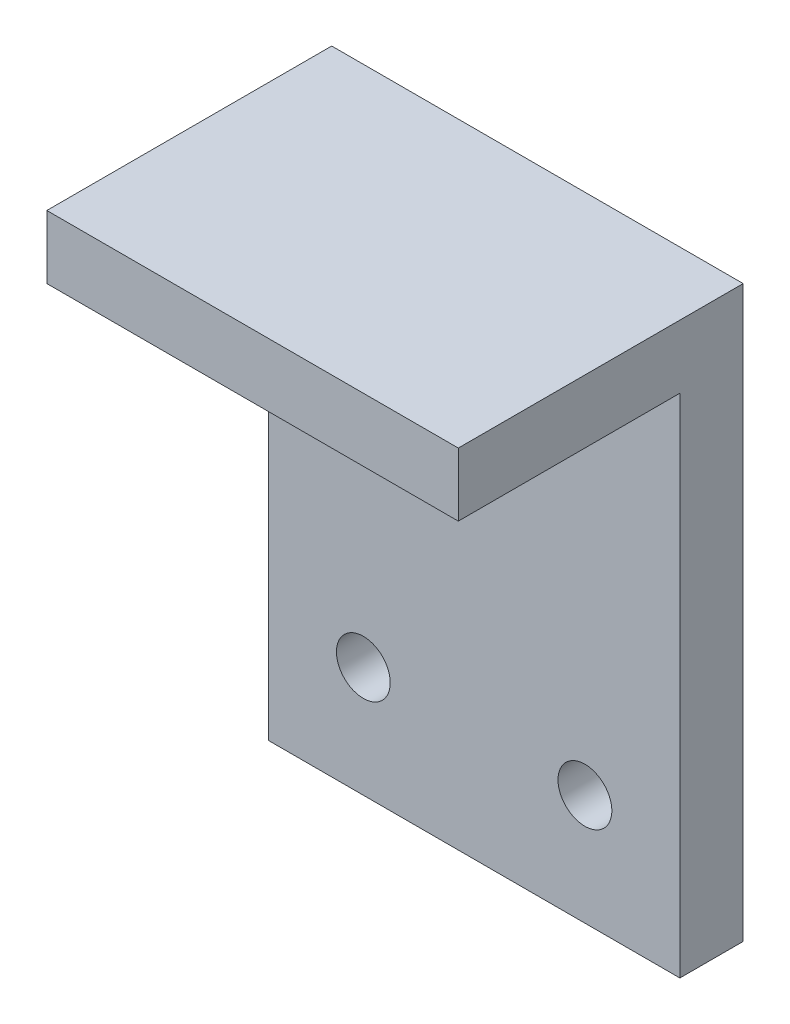
ISO-10303-21;
HEADER;
FILE_DESCRIPTION(('STEP AP214'),'2;1');
FILE_NAME('part.step','',(''),(''),'','','');
FILE_SCHEMA(('AUTOMOTIVE_DESIGN { 1 0 10303 214 1 1 1 1 }'));
ENDSEC;
DATA;
#1=APPLICATION_CONTEXT('core data for automotive mechanical design processes');
#2=APPLICATION_PROTOCOL_DEFINITION('international standard','automotive_design',2000,#1);
#3=PRODUCT_CONTEXT('',#1,'mechanical');
#4=PRODUCT('Part','Part','',(#3));
#5=PRODUCT_RELATED_PRODUCT_CATEGORY('part','',(#4));
#6=PRODUCT_DEFINITION_FORMATION('','',#4);
#7=PRODUCT_DEFINITION_CONTEXT('part definition',#1,'design');
#8=PRODUCT_DEFINITION('design','',#6,#7);
#9=PRODUCT_DEFINITION_SHAPE('','',#8);
#10=(LENGTH_UNIT() NAMED_UNIT(*) SI_UNIT(.MILLI.,.METRE.));
#11=(NAMED_UNIT(*) PLANE_ANGLE_UNIT() SI_UNIT($,.RADIAN.));
#12=(NAMED_UNIT(*) SI_UNIT($,.STERADIAN.) SOLID_ANGLE_UNIT());
#13=UNCERTAINTY_MEASURE_WITH_UNIT(LENGTH_MEASURE(1.E-05),#10,'distance_accuracy_value','');
#14=(GEOMETRIC_REPRESENTATION_CONTEXT(3) GLOBAL_UNCERTAINTY_ASSIGNED_CONTEXT((#13)) GLOBAL_UNIT_ASSIGNED_CONTEXT((#10,
#11,#12)) REPRESENTATION_CONTEXT('',''));
#15=CARTESIAN_POINT('',(0.,0.,0.));
#16=DIRECTION('',(0.,0.,1.));
#17=DIRECTION('',(1.,0.,0.));
#18=AXIS2_PLACEMENT_3D('',#15,#16,#17);
#19=CARTESIAN_POINT('',(0.,0.,4.));
#20=DIRECTION('',(0.,0.,-1.));
#21=DIRECTION('',(-1.,0.,0.));
#22=AXIS2_PLACEMENT_3D('',#19,#20,#21);
#23=PLANE('',#22);
#24=CARTESIAN_POINT('',(7.,-11.,4.));
#25=DIRECTION('',(0.,0.,1.));
#26=DIRECTION('',(-1.,0.,0.));
#27=AXIS2_PLACEMENT_3D('',#24,#25,#26);
#28=CIRCLE('',#27,1.7);
#29=CARTESIAN_POINT('',(5.3,-11.,4.));
#30=VERTEX_POINT('',#29);
#31=EDGE_CURVE('E165',#30,#30,#28,.T.);
#32=ORIENTED_EDGE('',*,*,#31,.F.);
#33=EDGE_LOOP('',(#32));
#34=FACE_BOUND('',#33,.T.);
#35=CARTESIAN_POINT('',(-7.,-11.,4.));
#36=DIRECTION('',(0.,0.,1.));
#37=DIRECTION('',(1.,0.,0.));
#38=AXIS2_PLACEMENT_3D('',#35,#36,#37);
#39=CIRCLE('',#38,1.7);
#40=CARTESIAN_POINT('',(-5.3,-11.,4.));
#41=VERTEX_POINT('',#40);
#42=EDGE_CURVE('E109',#41,#41,#39,.T.);
#43=ORIENTED_EDGE('',*,*,#42,.F.);
#44=EDGE_LOOP('',(#43));
#45=FACE_BOUND('',#44,.T.);
#46=DIRECTION('',(1.,0.,0.));
#47=VECTOR('',#46,1.);
#48=CARTESIAN_POINT('',(-13.,14.,4.));
#49=LINE('',#48,#47);
#50=CARTESIAN_POINT('',(-13.,14.,4.));
#51=VERTEX_POINT('',#50);
#52=CARTESIAN_POINT('',(13.,14.,4.));
#53=VERTEX_POINT('',#52);
#54=EDGE_CURVE('E62',#51,#53,#49,.T.);
#55=ORIENTED_EDGE('',*,*,#54,.F.);
#56=DIRECTION('',(0.,-1.,0.));
#57=VECTOR('',#56,1.);
#58=CARTESIAN_POINT('',(-13.,-18.,4.));
#59=LINE('',#58,#57);
#60=CARTESIAN_POINT('',(-13.,-18.,4.));
#61=VERTEX_POINT('',#60);
#62=EDGE_CURVE('E171',#51,#61,#59,.T.);
#63=ORIENTED_EDGE('',*,*,#62,.T.);
#64=DIRECTION('',(1.,0.,0.));
#65=VECTOR('',#64,1.);
#66=CARTESIAN_POINT('',(-13.,-18.,4.));
#67=LINE('',#66,#65);
#68=CARTESIAN_POINT('',(13.,-18.,4.));
#69=VERTEX_POINT('',#68);
#70=EDGE_CURVE('E70',#61,#69,#67,.T.);
#71=ORIENTED_EDGE('',*,*,#70,.T.);
#72=DIRECTION('',(0.,1.,0.));
#73=VECTOR('',#72,1.);
#74=CARTESIAN_POINT('',(13.,-18.,4.));
#75=LINE('',#74,#73);
#76=EDGE_CURVE('E100',#69,#53,#75,.T.);
#77=ORIENTED_EDGE('',*,*,#76,.T.);
#78=EDGE_LOOP('',(#55,#63,#71,#77));
#79=FACE_BOUND('',#78,.T.);
#80=ADVANCED_FACE('F44',(#34,#45,#79),#23,.F.);
#81=CARTESIAN_POINT('',(13.,-18.,4.));
#82=DIRECTION('',(-1.,0.,0.));
#83=DIRECTION('',(0.,0.,1.));
#84=AXIS2_PLACEMENT_3D('',#81,#82,#83);
#85=PLANE('',#84);
#86=DIRECTION('',(0.,1.,0.));
#87=VECTOR('',#86,1.);
#88=CARTESIAN_POINT('',(13.,-18.,0.));
#89=LINE('',#88,#87);
#90=CARTESIAN_POINT('',(13.,-18.,0.));
#91=VERTEX_POINT('',#90);
#92=CARTESIAN_POINT('',(13.,18.,0.));
#93=VERTEX_POINT('',#92);
#94=EDGE_CURVE('E103',#91,#93,#89,.T.);
#95=ORIENTED_EDGE('',*,*,#94,.T.);
#96=DIRECTION('',(0.,0.,-1.));
#97=VECTOR('',#96,1.);
#98=CARTESIAN_POINT('',(13.,18.,4.));
#99=LINE('',#98,#97);
#100=CARTESIAN_POINT('',(13.,18.,18.));
#101=VERTEX_POINT('',#100);
#102=EDGE_CURVE('E11',#101,#93,#99,.T.);
#103=ORIENTED_EDGE('',*,*,#102,.F.);
#104=DIRECTION('',(0.,1.,0.));
#105=VECTOR('',#104,1.);
#106=CARTESIAN_POINT('',(13.,18.,18.));
#107=LINE('',#106,#105);
#108=CARTESIAN_POINT('',(13.,14.,18.));
#109=VERTEX_POINT('',#108);
#110=EDGE_CURVE('E148',#109,#101,#107,.T.);
#111=ORIENTED_EDGE('',*,*,#110,.F.);
#112=DIRECTION('',(0.,0.,-1.));
#113=VECTOR('',#112,1.);
#114=CARTESIAN_POINT('',(13.,14.,18.));
#115=LINE('',#114,#113);
#116=EDGE_CURVE('E146',#109,#53,#115,.T.);
#117=ORIENTED_EDGE('',*,*,#116,.T.);
#118=ORIENTED_EDGE('',*,*,#76,.F.);
#119=DIRECTION('',(0.,0.,-1.));
#120=VECTOR('',#119,1.);
#121=CARTESIAN_POINT('',(13.,-18.,4.));
#122=LINE('',#121,#120);
#123=EDGE_CURVE('E90',#69,#91,#122,.T.);
#124=ORIENTED_EDGE('',*,*,#123,.T.);
#125=EDGE_LOOP('',(#95,#103,#111,#117,#118,#124));
#126=FACE_BOUND('',#125,.T.);
#127=ADVANCED_FACE('F50',(#126),#85,.F.);
#128=CARTESIAN_POINT('',(-13.,18.,4.));
#129=DIRECTION('',(0.,-1.,0.));
#130=DIRECTION('',(0.,0.,-1.));
#131=AXIS2_PLACEMENT_3D('',#128,#129,#130);
#132=PLANE('',#131);
#133=DIRECTION('',(-1.,0.,0.));
#134=VECTOR('',#133,1.);
#135=CARTESIAN_POINT('',(-13.,18.,0.));
#136=LINE('',#135,#134);
#137=CARTESIAN_POINT('',(-13.,18.,0.));
#138=VERTEX_POINT('',#137);
#139=EDGE_CURVE('E107',#93,#138,#136,.T.);
#140=ORIENTED_EDGE('',*,*,#139,.T.);
#141=DIRECTION('',(0.,0.,-1.));
#142=VECTOR('',#141,1.);
#143=CARTESIAN_POINT('',(-13.,18.,4.));
#144=LINE('',#143,#142);
#145=CARTESIAN_POINT('',(-13.,18.,18.));
#146=VERTEX_POINT('',#145);
#147=EDGE_CURVE('E53',#146,#138,#144,.T.);
#148=ORIENTED_EDGE('',*,*,#147,.F.);
#149=DIRECTION('',(-1.,0.,0.));
#150=VECTOR('',#149,1.);
#151=CARTESIAN_POINT('',(-13.,18.,18.));
#152=LINE('',#151,#150);
#153=EDGE_CURVE('E137',#101,#146,#152,.T.);
#154=ORIENTED_EDGE('',*,*,#153,.F.);
#155=ORIENTED_EDGE('',*,*,#102,.T.);
#156=EDGE_LOOP('',(#140,#148,#154,#155));
#157=FACE_BOUND('',#156,.T.);
#158=ADVANCED_FACE('F136',(#157),#132,.F.);
#159=CARTESIAN_POINT('',(-13.,-18.,4.));
#160=DIRECTION('',(1.,0.,0.));
#161=DIRECTION('',(0.,0.,-1.));
#162=AXIS2_PLACEMENT_3D('',#159,#160,#161);
#163=PLANE('',#162);
#164=DIRECTION('',(0.,-1.,0.));
#165=VECTOR('',#164,1.);
#166=CARTESIAN_POINT('',(-13.,-18.,0.));
#167=LINE('',#166,#165);
#168=CARTESIAN_POINT('',(-13.,-18.,0.));
#169=VERTEX_POINT('',#168);
#170=EDGE_CURVE('E98',#138,#169,#167,.T.);
#171=ORIENTED_EDGE('',*,*,#170,.T.);
#172=DIRECTION('',(0.,0.,-1.));
#173=VECTOR('',#172,1.);
#174=CARTESIAN_POINT('',(-13.,-18.,4.));
#175=LINE('',#174,#173);
#176=EDGE_CURVE('E95',#61,#169,#175,.T.);
#177=ORIENTED_EDGE('',*,*,#176,.F.);
#178=ORIENTED_EDGE('',*,*,#62,.F.);
#179=DIRECTION('',(0.,0.,-1.));
#180=VECTOR('',#179,1.);
#181=CARTESIAN_POINT('',(-13.,14.,18.));
#182=LINE('',#181,#180);
#183=CARTESIAN_POINT('',(-13.,14.,18.));
#184=VERTEX_POINT('',#183);
#185=EDGE_CURVE('E155',#184,#51,#182,.T.);
#186=ORIENTED_EDGE('',*,*,#185,.F.);
#187=DIRECTION('',(0.,-1.,0.));
#188=VECTOR('',#187,1.);
#189=CARTESIAN_POINT('',(-13.,18.,18.));
#190=LINE('',#189,#188);
#191=EDGE_CURVE('E135',#146,#184,#190,.T.);
#192=ORIENTED_EDGE('',*,*,#191,.F.);
#193=ORIENTED_EDGE('',*,*,#147,.T.);
#194=EDGE_LOOP('',(#171,#177,#178,#186,#192,#193));
#195=FACE_BOUND('',#194,.T.);
#196=ADVANCED_FACE('F129',(#195),#163,.F.);
#197=CARTESIAN_POINT('',(-13.,-18.,4.));
#198=DIRECTION('',(0.,1.,0.));
#199=DIRECTION('',(0.,0.,1.));
#200=AXIS2_PLACEMENT_3D('',#197,#198,#199);
#201=PLANE('',#200);
#202=DIRECTION('',(1.,0.,0.));
#203=VECTOR('',#202,1.);
#204=CARTESIAN_POINT('',(-13.,-18.,0.));
#205=LINE('',#204,#203);
#206=EDGE_CURVE('E88',#169,#91,#205,.T.);
#207=ORIENTED_EDGE('',*,*,#206,.T.);
#208=ORIENTED_EDGE('',*,*,#123,.F.);
#209=ORIENTED_EDGE('',*,*,#70,.F.);
#210=ORIENTED_EDGE('',*,*,#176,.T.);
#211=EDGE_LOOP('',(#207,#208,#209,#210));
#212=FACE_BOUND('',#211,.T.);
#213=ADVANCED_FACE('F86',(#212),#201,.F.);
#214=CARTESIAN_POINT('',(0.,0.,0.));
#215=DIRECTION('',(0.,0.,-1.));
#216=DIRECTION('',(-1.,0.,0.));
#217=AXIS2_PLACEMENT_3D('',#214,#215,#216);
#218=PLANE('',#217);
#219=CARTESIAN_POINT('',(-7.,-11.,0.));
#220=DIRECTION('',(0.,0.,-1.));
#221=DIRECTION('',(-1.,0.,0.));
#222=AXIS2_PLACEMENT_3D('',#219,#220,#221);
#223=CIRCLE('',#222,1.7);
#224=CARTESIAN_POINT('',(-8.7,-11.,0.));
#225=VERTEX_POINT('',#224);
#226=EDGE_CURVE('E117',#225,#225,#223,.F.);
#227=ORIENTED_EDGE('',*,*,#226,.T.);
#228=EDGE_LOOP('',(#227));
#229=FACE_BOUND('',#228,.T.);
#230=CARTESIAN_POINT('',(7.,-11.,0.));
#231=DIRECTION('',(0.,0.,-1.));
#232=DIRECTION('',(-1.,0.,0.));
#233=AXIS2_PLACEMENT_3D('',#230,#231,#232);
#234=CIRCLE('',#233,1.7);
#235=CARTESIAN_POINT('',(5.3,-11.,0.));
#236=VERTEX_POINT('',#235);
#237=EDGE_CURVE('E170',#236,#236,#234,.F.);
#238=ORIENTED_EDGE('',*,*,#237,.T.);
#239=EDGE_LOOP('',(#238));
#240=FACE_BOUND('',#239,.T.);
#241=ORIENTED_EDGE('',*,*,#94,.F.);
#242=ORIENTED_EDGE('',*,*,#206,.F.);
#243=ORIENTED_EDGE('',*,*,#170,.F.);
#244=ORIENTED_EDGE('',*,*,#139,.F.);
#245=EDGE_LOOP('',(#241,#242,#243,#244));
#246=FACE_BOUND('',#245,.T.);
#247=ADVANCED_FACE('F110',(#229,#240,#246),#218,.T.);
#248=CARTESIAN_POINT('',(7.,-11.,-0.00100000000000013));
#249=DIRECTION('',(0.,0.,1.));
#250=DIRECTION('',(1.,0.,0.));
#251=AXIS2_PLACEMENT_3D('',#248,#249,#250);
#252=CYLINDRICAL_SURFACE('',#251,1.7);
#253=ORIENTED_EDGE('',*,*,#237,.F.);
#254=EDGE_LOOP('',(#253));
#255=FACE_BOUND('',#254,.T.);
#256=ORIENTED_EDGE('',*,*,#31,.T.);
#257=EDGE_LOOP('',(#256));
#258=FACE_BOUND('',#257,.T.);
#259=ADVANCED_FACE('F200',(#255,#258),#252,.F.);
#260=CARTESIAN_POINT('',(-7.,-11.,-0.00100000000000013));
#261=DIRECTION('',(0.,0.,1.));
#262=DIRECTION('',(1.,0.,0.));
#263=AXIS2_PLACEMENT_3D('',#260,#261,#262);
#264=CYLINDRICAL_SURFACE('',#263,1.7);
#265=ORIENTED_EDGE('',*,*,#226,.F.);
#266=EDGE_LOOP('',(#265));
#267=FACE_BOUND('',#266,.T.);
#268=ORIENTED_EDGE('',*,*,#42,.T.);
#269=EDGE_LOOP('',(#268));
#270=FACE_BOUND('',#269,.T.);
#271=ADVANCED_FACE('F191',(#267,#270),#264,.F.);
#272=CARTESIAN_POINT('',(-13.,14.,18.));
#273=DIRECTION('',(0.,1.,0.));
#274=DIRECTION('',(-1.,0.,0.));
#275=AXIS2_PLACEMENT_3D('',#272,#273,#274);
#276=PLANE('',#275);
#277=ORIENTED_EDGE('',*,*,#54,.T.);
#278=ORIENTED_EDGE('',*,*,#116,.F.);
#279=DIRECTION('',(1.,0.,0.));
#280=VECTOR('',#279,1.);
#281=CARTESIAN_POINT('',(-13.,14.,18.));
#282=LINE('',#281,#280);
#283=EDGE_CURVE('E152',#184,#109,#282,.T.);
#284=ORIENTED_EDGE('',*,*,#283,.F.);
#285=ORIENTED_EDGE('',*,*,#185,.T.);
#286=EDGE_LOOP('',(#277,#278,#284,#285));
#287=FACE_BOUND('',#286,.T.);
#288=ADVANCED_FACE('F179',(#287),#276,.F.);
#289=CARTESIAN_POINT('',(0.,0.,18.));
#290=DIRECTION('',(0.,0.,1.));
#291=DIRECTION('',(1.,0.,0.));
#292=AXIS2_PLACEMENT_3D('',#289,#290,#291);
#293=PLANE('',#292);
#294=ORIENTED_EDGE('',*,*,#191,.T.);
#295=ORIENTED_EDGE('',*,*,#283,.T.);
#296=ORIENTED_EDGE('',*,*,#110,.T.);
#297=ORIENTED_EDGE('',*,*,#153,.T.);
#298=EDGE_LOOP('',(#294,#295,#296,#297));
#299=FACE_BOUND('',#298,.T.);
#300=ADVANCED_FACE('F142',(#299),#293,.T.);
#301=CLOSED_SHELL('',(#80,#127,#158,#196,#213,#247,#259,#271,#288,#300));
#302=MANIFOLD_SOLID_BREP('B2',#301);
#303=ADVANCED_BREP_SHAPE_REPRESENTATION('',(#18,#302),#14);
#304=SHAPE_DEFINITION_REPRESENTATION(#9,#303);
ENDSEC;
END-ISO-10303-21;
